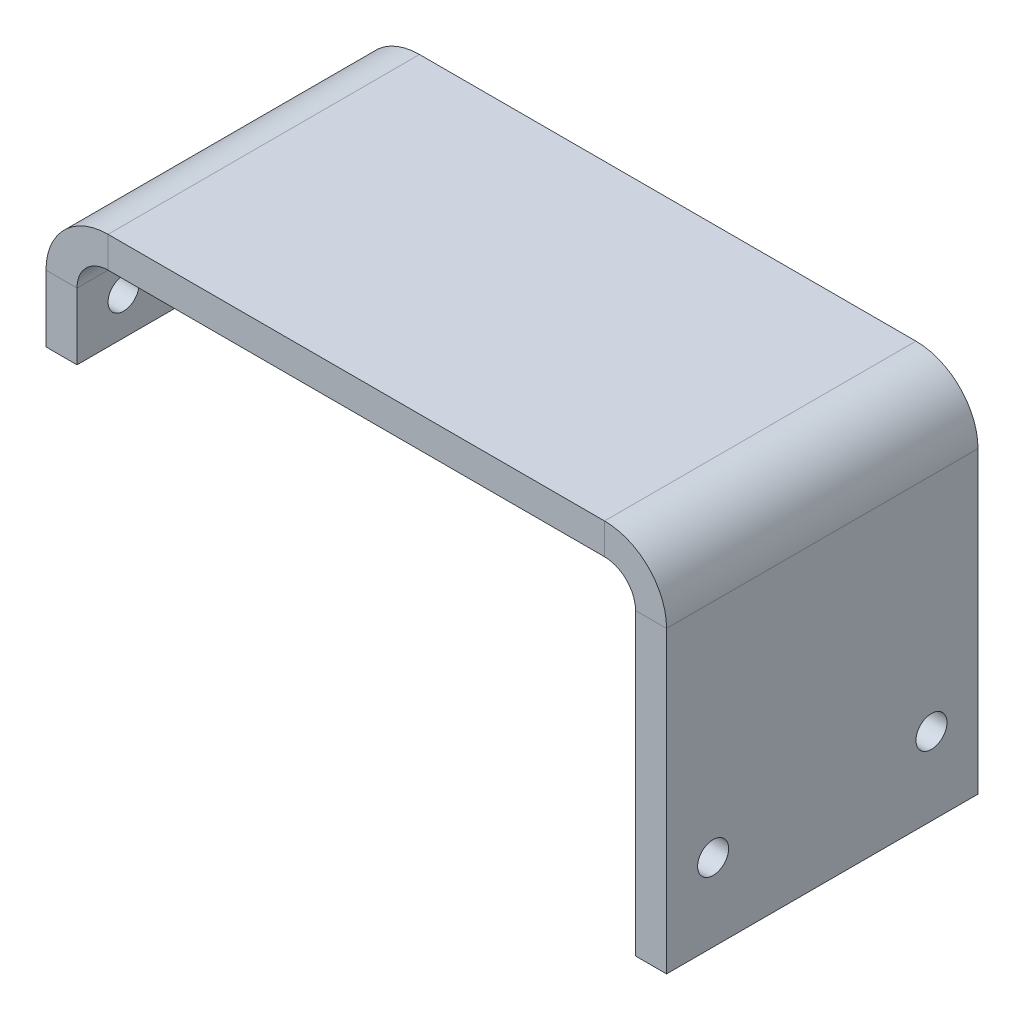
ISO-10303-21;
HEADER;
FILE_DESCRIPTION(('STEP AP214'),'2;1');
FILE_NAME('part.step','',(''),(''),'','','');
FILE_SCHEMA(('AUTOMOTIVE_DESIGN { 1 0 10303 214 1 1 1 1 }'));
ENDSEC;
DATA;
#1=APPLICATION_CONTEXT('core data for automotive mechanical design processes');
#2=APPLICATION_PROTOCOL_DEFINITION('international standard','automotive_design',2000,#1);
#3=PRODUCT_CONTEXT('',#1,'mechanical');
#4=PRODUCT('Part','Part','',(#3));
#5=PRODUCT_RELATED_PRODUCT_CATEGORY('part','',(#4));
#6=PRODUCT_DEFINITION_FORMATION('','',#4);
#7=PRODUCT_DEFINITION_CONTEXT('part definition',#1,'design');
#8=PRODUCT_DEFINITION('design','',#6,#7);
#9=PRODUCT_DEFINITION_SHAPE('','',#8);
#10=(LENGTH_UNIT() NAMED_UNIT(*) SI_UNIT(.MILLI.,.METRE.));
#11=(NAMED_UNIT(*) PLANE_ANGLE_UNIT() SI_UNIT($,.RADIAN.));
#12=(NAMED_UNIT(*) SI_UNIT($,.STERADIAN.) SOLID_ANGLE_UNIT());
#13=UNCERTAINTY_MEASURE_WITH_UNIT(LENGTH_MEASURE(1.E-05),#10,'distance_accuracy_value','');
#14=(GEOMETRIC_REPRESENTATION_CONTEXT(3) GLOBAL_UNCERTAINTY_ASSIGNED_CONTEXT((#13)) GLOBAL_UNIT_ASSIGNED_CONTEXT((#10,
#11,#12)) REPRESENTATION_CONTEXT('',''));
#15=CARTESIAN_POINT('',(0.,0.,0.));
#16=DIRECTION('',(0.,0.,1.));
#17=DIRECTION('',(1.,0.,0.));
#18=AXIS2_PLACEMENT_3D('',#15,#16,#17);
#19=CARTESIAN_POINT('',(-65.,-4.,20.075));
#20=DIRECTION('',(0.,0.,1.));
#21=DIRECTION('',(1.,0.,0.));
#22=AXIS2_PLACEMENT_3D('',#19,#20,#21);
#23=PLANE('',#22);
#24=DIRECTION('',(1.,0.,0.));
#25=VECTOR('',#24,1.);
#26=CARTESIAN_POINT('',(-65.,-4.,20.075));
#27=LINE('',#26,#25);
#28=CARTESIAN_POINT('',(-47.,-4.,20.075));
#29=VERTEX_POINT('',#28);
#30=CARTESIAN_POINT('',(17.,-4.,20.075));
#31=VERTEX_POINT('',#30);
#32=EDGE_CURVE('E221',#29,#31,#27,.T.);
#33=ORIENTED_EDGE('',*,*,#32,.T.);
#34=DIRECTION('',(0.,1.,0.));
#35=VECTOR('',#34,1.);
#36=CARTESIAN_POINT('',(17.,-4.,20.075));
#37=LINE('',#36,#35);
#38=CARTESIAN_POINT('',(17.,0.,20.075));
#39=VERTEX_POINT('',#38);
#40=EDGE_CURVE('E12',#31,#39,#37,.T.);
#41=ORIENTED_EDGE('',*,*,#40,.T.);
#42=DIRECTION('',(1.,0.,0.));
#43=VECTOR('',#42,1.);
#44=CARTESIAN_POINT('',(-65.,0.,20.075));
#45=LINE('',#44,#43);
#46=CARTESIAN_POINT('',(-47.,0.,20.075));
#47=VERTEX_POINT('',#46);
#48=EDGE_CURVE('E205',#47,#39,#45,.T.);
#49=ORIENTED_EDGE('',*,*,#48,.F.);
#50=DIRECTION('',(0.,1.,0.));
#51=VECTOR('',#50,1.);
#52=CARTESIAN_POINT('',(-47.,-4.,20.075));
#53=LINE('',#52,#51);
#54=EDGE_CURVE('E210',#29,#47,#53,.T.);
#55=ORIENTED_EDGE('',*,*,#54,.F.);
#56=EDGE_LOOP('',(#33,#41,#49,#55));
#57=FACE_BOUND('',#56,.T.);
#58=ADVANCED_FACE('F47',(#57),#23,.T.);
#59=CARTESIAN_POINT('',(-65.,-4.,-20.075));
#60=DIRECTION('',(0.,0.,-1.));
#61=DIRECTION('',(-1.,0.,0.));
#62=AXIS2_PLACEMENT_3D('',#59,#60,#61);
#63=PLANE('',#62);
#64=DIRECTION('',(-1.,0.,0.));
#65=VECTOR('',#64,1.);
#66=CARTESIAN_POINT('',(-65.,0.,-20.075));
#67=LINE('',#66,#65);
#68=CARTESIAN_POINT('',(17.,0.,-20.075));
#69=VERTEX_POINT('',#68);
#70=CARTESIAN_POINT('',(-47.,0.,-20.075));
#71=VERTEX_POINT('',#70);
#72=EDGE_CURVE('E206',#69,#71,#67,.T.);
#73=ORIENTED_EDGE('',*,*,#72,.F.);
#74=DIRECTION('',(0.,-1.,0.));
#75=VECTOR('',#74,1.);
#76=CARTESIAN_POINT('',(17.,-4.,-20.075));
#77=LINE('',#76,#75);
#78=CARTESIAN_POINT('',(17.,-4.,-20.075));
#79=VERTEX_POINT('',#78);
#80=EDGE_CURVE('E262',#69,#79,#77,.T.);
#81=ORIENTED_EDGE('',*,*,#80,.T.);
#82=DIRECTION('',(-1.,0.,0.));
#83=VECTOR('',#82,1.);
#84=CARTESIAN_POINT('',(-65.,-4.,-20.075));
#85=LINE('',#84,#83);
#86=CARTESIAN_POINT('',(-47.,-4.,-20.075));
#87=VERTEX_POINT('',#86);
#88=EDGE_CURVE('E50',#79,#87,#85,.T.);
#89=ORIENTED_EDGE('',*,*,#88,.T.);
#90=DIRECTION('',(0.,-1.,0.));
#91=VECTOR('',#90,1.);
#92=CARTESIAN_POINT('',(-47.,-4.,-20.075));
#93=LINE('',#92,#91);
#94=EDGE_CURVE('E207',#71,#87,#93,.T.);
#95=ORIENTED_EDGE('',*,*,#94,.F.);
#96=EDGE_LOOP('',(#73,#81,#89,#95));
#97=FACE_BOUND('',#96,.T.);
#98=ADVANCED_FACE('F275',(#97),#63,.T.);
#99=CARTESIAN_POINT('',(0.,-4.,0.));
#100=DIRECTION('',(0.,-1.,0.));
#101=DIRECTION('',(0.,0.,-1.));
#102=AXIS2_PLACEMENT_3D('',#99,#100,#101);
#103=PLANE('',#102);
#104=ORIENTED_EDGE('',*,*,#88,.F.);
#105=DIRECTION('',(0.,0.,1.));
#106=VECTOR('',#105,1.);
#107=CARTESIAN_POINT('',(17.,-4.,0.));
#108=LINE('',#107,#106);
#109=EDGE_CURVE('E253',#79,#31,#108,.T.);
#110=ORIENTED_EDGE('',*,*,#109,.T.);
#111=ORIENTED_EDGE('',*,*,#32,.F.);
#112=DIRECTION('',(0.,0.,1.));
#113=VECTOR('',#112,1.);
#114=CARTESIAN_POINT('',(-47.,-4.,0.));
#115=LINE('',#114,#113);
#116=EDGE_CURVE('E197',#87,#29,#115,.T.);
#117=ORIENTED_EDGE('',*,*,#116,.F.);
#118=EDGE_LOOP('',(#104,#110,#111,#117));
#119=FACE_BOUND('',#118,.T.);
#120=ADVANCED_FACE('F278',(#119),#103,.T.);
#121=CARTESIAN_POINT('',(-51.,-16.5752220392306,20.075));
#122=DIRECTION('',(0.,0.,1.));
#123=DIRECTION('',(0.,1.,0.));
#124=AXIS2_PLACEMENT_3D('',#121,#122,#123);
#125=PLANE('',#124);
#126=DIRECTION('',(0.,1.,0.));
#127=VECTOR('',#126,1.);
#128=CARTESIAN_POINT('',(-51.,-16.5752220392306,20.075));
#129=LINE('',#128,#127);
#130=CARTESIAN_POINT('',(-51.,-16.5752220392306,20.075));
#131=VERTEX_POINT('',#130);
#132=CARTESIAN_POINT('',(-51.,-8.,20.075));
#133=VERTEX_POINT('',#132);
#134=EDGE_CURVE('E231',#131,#133,#129,.T.);
#135=ORIENTED_EDGE('',*,*,#134,.T.);
#136=DIRECTION('',(-1.,0.,0.));
#137=VECTOR('',#136,1.);
#138=CARTESIAN_POINT('',(-51.,-8.,20.075));
#139=LINE('',#138,#137);
#140=CARTESIAN_POINT('',(-55.,-8.00000000000002,20.075));
#141=VERTEX_POINT('',#140);
#142=EDGE_CURVE('E250',#133,#141,#139,.T.);
#143=ORIENTED_EDGE('',*,*,#142,.T.);
#144=DIRECTION('',(0.,1.,0.));
#145=VECTOR('',#144,1.);
#146=CARTESIAN_POINT('',(-55.,-16.5752220392306,20.075));
#147=LINE('',#146,#145);
#148=CARTESIAN_POINT('',(-55.,-16.5752220392306,20.075));
#149=VERTEX_POINT('',#148);
#150=EDGE_CURVE('E236',#149,#141,#147,.T.);
#151=ORIENTED_EDGE('',*,*,#150,.F.);
#152=DIRECTION('',(-1.,0.,0.));
#153=VECTOR('',#152,1.);
#154=CARTESIAN_POINT('',(-51.,-16.5752220392306,20.075));
#155=LINE('',#154,#153);
#156=EDGE_CURVE('E237',#131,#149,#155,.T.);
#157=ORIENTED_EDGE('',*,*,#156,.F.);
#158=EDGE_LOOP('',(#135,#143,#151,#157));
#159=FACE_BOUND('',#158,.T.);
#160=ADVANCED_FACE('F291',(#159),#125,.T.);
#161=CARTESIAN_POINT('',(-51.,-16.5752220392306,-20.075));
#162=DIRECTION('',(0.,0.,-1.));
#163=DIRECTION('',(0.,-1.,0.));
#164=AXIS2_PLACEMENT_3D('',#161,#162,#163);
#165=PLANE('',#164);
#166=DIRECTION('',(0.,-1.,0.));
#167=VECTOR('',#166,1.);
#168=CARTESIAN_POINT('',(-55.,-16.5752220392306,-20.075));
#169=LINE('',#168,#167);
#170=CARTESIAN_POINT('',(-55.,-8.00000000000002,-20.075));
#171=VERTEX_POINT('',#170);
#172=CARTESIAN_POINT('',(-55.,-16.5752220392306,-20.075));
#173=VERTEX_POINT('',#172);
#174=EDGE_CURVE('E225',#171,#173,#169,.T.);
#175=ORIENTED_EDGE('',*,*,#174,.F.);
#176=DIRECTION('',(1.,0.,0.));
#177=VECTOR('',#176,1.);
#178=CARTESIAN_POINT('',(-51.,-8.00000000000001,-20.075));
#179=LINE('',#178,#177);
#180=CARTESIAN_POINT('',(-51.,-8.00000000000002,-20.075));
#181=VERTEX_POINT('',#180);
#182=EDGE_CURVE('E245',#171,#181,#179,.T.);
#183=ORIENTED_EDGE('',*,*,#182,.T.);
#184=DIRECTION('',(0.,-1.,0.));
#185=VECTOR('',#184,1.);
#186=CARTESIAN_POINT('',(-51.,-16.5752220392306,-20.075));
#187=LINE('',#186,#185);
#188=CARTESIAN_POINT('',(-51.,-16.5752220392306,-20.075));
#189=VERTEX_POINT('',#188);
#190=EDGE_CURVE('E232',#181,#189,#187,.T.);
#191=ORIENTED_EDGE('',*,*,#190,.T.);
#192=DIRECTION('',(-1.,0.,0.));
#193=VECTOR('',#192,1.);
#194=CARTESIAN_POINT('',(-51.,-16.5752220392306,-20.075));
#195=LINE('',#194,#193);
#196=EDGE_CURVE('E240',#189,#173,#195,.T.);
#197=ORIENTED_EDGE('',*,*,#196,.T.);
#198=EDGE_LOOP('',(#175,#183,#191,#197));
#199=FACE_BOUND('',#198,.T.);
#200=ADVANCED_FACE('F299',(#199),#165,.T.);
#201=CARTESIAN_POINT('',(-51.0000000000002,48.4247779607694,0.));
#202=DIRECTION('',(1.,0.,0.));
#203=DIRECTION('',(0.,0.,-1.));
#204=AXIS2_PLACEMENT_3D('',#201,#202,#203);
#205=PLANE('',#204);
#206=CARTESIAN_POINT('',(-51.,-11.5752220392306,-14.075));
#207=DIRECTION('',(-1.,0.,0.));
#208=DIRECTION('',(0.,0.,1.));
#209=AXIS2_PLACEMENT_3D('',#206,#207,#208);
#210=CIRCLE('',#209,2.);
#211=CARTESIAN_POINT('',(-51.,-11.5752220392306,-12.075));
#212=VERTEX_POINT('',#211);
#213=EDGE_CURVE('E222',#212,#212,#210,.T.);
#214=ORIENTED_EDGE('',*,*,#213,.T.);
#215=EDGE_LOOP('',(#214));
#216=FACE_BOUND('',#215,.T.);
#217=CARTESIAN_POINT('',(-51.,-11.5752220392306,14.075));
#218=DIRECTION('',(-1.,0.,0.));
#219=DIRECTION('',(0.,0.,-1.));
#220=AXIS2_PLACEMENT_3D('',#217,#218,#219);
#221=CIRCLE('',#220,2.);
#222=CARTESIAN_POINT('',(-51.,-11.5752220392306,12.075));
#223=VERTEX_POINT('',#222);
#224=EDGE_CURVE('E214',#223,#223,#221,.T.);
#225=ORIENTED_EDGE('',*,*,#224,.T.);
#226=EDGE_LOOP('',(#225));
#227=FACE_BOUND('',#226,.T.);
#228=ORIENTED_EDGE('',*,*,#190,.F.);
#229=DIRECTION('',(0.,0.,1.));
#230=VECTOR('',#229,1.);
#231=CARTESIAN_POINT('',(-51.,-8.00000000000001,0.));
#232=LINE('',#231,#230);
#233=EDGE_CURVE('E239',#181,#133,#232,.T.);
#234=ORIENTED_EDGE('',*,*,#233,.T.);
#235=ORIENTED_EDGE('',*,*,#134,.F.);
#236=DIRECTION('',(0.,0.,1.));
#237=VECTOR('',#236,1.);
#238=CARTESIAN_POINT('',(-51.,-16.5752220392306,20.075));
#239=LINE('',#238,#237);
#240=EDGE_CURVE('E228',#189,#131,#239,.T.);
#241=ORIENTED_EDGE('',*,*,#240,.F.);
#242=EDGE_LOOP('',(#228,#234,#235,#241));
#243=FACE_BOUND('',#242,.T.);
#244=ADVANCED_FACE('F288',(#216,#227,#243),#205,.T.);
#245=CARTESIAN_POINT('',(-51.,-16.5752220392306,20.075));
#246=DIRECTION('',(0.,-1.,0.));
#247=DIRECTION('',(0.,0.,1.));
#248=AXIS2_PLACEMENT_3D('',#245,#246,#247);
#249=PLANE('',#248);
#250=DIRECTION('',(0.,0.,1.));
#251=VECTOR('',#250,1.);
#252=CARTESIAN_POINT('',(-55.,-16.5752220392306,20.075));
#253=LINE('',#252,#251);
#254=EDGE_CURVE('E233',#173,#149,#253,.T.);
#255=ORIENTED_EDGE('',*,*,#254,.F.);
#256=ORIENTED_EDGE('',*,*,#196,.F.);
#257=ORIENTED_EDGE('',*,*,#240,.T.);
#258=ORIENTED_EDGE('',*,*,#156,.T.);
#259=EDGE_LOOP('',(#255,#256,#257,#258));
#260=FACE_BOUND('',#259,.T.);
#261=ADVANCED_FACE('F296',(#260),#249,.T.);
#262=CARTESIAN_POINT('',(-55.0000000000002,48.4247779607694,0.));
#263=DIRECTION('',(1.,0.,0.));
#264=DIRECTION('',(0.,0.,-1.));
#265=AXIS2_PLACEMENT_3D('',#262,#263,#264);
#266=PLANE('',#265);
#267=DIRECTION('',(0.,0.,1.));
#268=VECTOR('',#267,1.);
#269=CARTESIAN_POINT('',(-55.,-8.00000000000002,0.));
#270=LINE('',#269,#268);
#271=EDGE_CURVE('E248',#171,#141,#270,.T.);
#272=ORIENTED_EDGE('',*,*,#271,.F.);
#273=ORIENTED_EDGE('',*,*,#174,.T.);
#274=ORIENTED_EDGE('',*,*,#254,.T.);
#275=ORIENTED_EDGE('',*,*,#150,.T.);
#276=EDGE_LOOP('',(#272,#273,#274,#275));
#277=FACE_BOUND('',#276,.T.);
#278=CARTESIAN_POINT('',(-55.,-11.5752220392306,14.075));
#279=DIRECTION('',(-1.,0.,0.));
#280=DIRECTION('',(0.,0.,-1.));
#281=AXIS2_PLACEMENT_3D('',#278,#279,#280);
#282=CIRCLE('',#281,2.);
#283=CARTESIAN_POINT('',(-55.,-11.5752220392306,12.075));
#284=VERTEX_POINT('',#283);
#285=EDGE_CURVE('E218',#284,#284,#282,.T.);
#286=ORIENTED_EDGE('',*,*,#285,.F.);
#287=EDGE_LOOP('',(#286));
#288=FACE_BOUND('',#287,.T.);
#289=CARTESIAN_POINT('',(-55.,-11.5752220392306,-14.075));
#290=DIRECTION('',(-1.,0.,0.));
#291=DIRECTION('',(0.,0.,1.));
#292=AXIS2_PLACEMENT_3D('',#289,#290,#291);
#293=CIRCLE('',#292,2.);
#294=CARTESIAN_POINT('',(-55.,-11.5752220392306,-12.075));
#295=VERTEX_POINT('',#294);
#296=EDGE_CURVE('E217',#295,#295,#293,.T.);
#297=ORIENTED_EDGE('',*,*,#296,.F.);
#298=EDGE_LOOP('',(#297));
#299=FACE_BOUND('',#298,.T.);
#300=ADVANCED_FACE('F380',(#277,#288,#299),#266,.F.);
#301=CARTESIAN_POINT('',(-51.,-11.5752220392306,-14.075));
#302=DIRECTION('',(-1.,0.,0.));
#303=DIRECTION('',(0.,0.,1.));
#304=AXIS2_PLACEMENT_3D('',#301,#302,#303);
#305=CYLINDRICAL_SURFACE('',#304,2.);
#306=ORIENTED_EDGE('',*,*,#213,.F.);
#307=EDGE_LOOP('',(#306));
#308=FACE_BOUND('',#307,.T.);
#309=ORIENTED_EDGE('',*,*,#296,.T.);
#310=EDGE_LOOP('',(#309));
#311=FACE_BOUND('',#310,.T.);
#312=ADVANCED_FACE('F374',(#308,#311),#305,.F.);
#313=CARTESIAN_POINT('',(-51.,-11.5752220392306,14.075));
#314=DIRECTION('',(-1.,0.,0.));
#315=DIRECTION('',(0.,0.,1.));
#316=AXIS2_PLACEMENT_3D('',#313,#314,#315);
#317=CYLINDRICAL_SURFACE('',#316,2.);
#318=ORIENTED_EDGE('',*,*,#224,.F.);
#319=EDGE_LOOP('',(#318));
#320=FACE_BOUND('',#319,.T.);
#321=ORIENTED_EDGE('',*,*,#285,.T.);
#322=EDGE_LOOP('',(#321));
#323=FACE_BOUND('',#322,.T.);
#324=ADVANCED_FACE('F368',(#320,#323),#317,.F.);
#325=CARTESIAN_POINT('',(0.,0.,0.));
#326=DIRECTION('',(0.,-1.,0.));
#327=DIRECTION('',(0.,0.,-1.));
#328=AXIS2_PLACEMENT_3D('',#325,#326,#327);
#329=PLANE('',#328);
#330=DIRECTION('',(0.,0.,1.));
#331=VECTOR('',#330,1.);
#332=CARTESIAN_POINT('',(17.,0.,0.));
#333=LINE('',#332,#331);
#334=EDGE_CURVE('E55',#69,#39,#333,.T.);
#335=ORIENTED_EDGE('',*,*,#334,.F.);
#336=ORIENTED_EDGE('',*,*,#72,.T.);
#337=DIRECTION('',(0.,0.,1.));
#338=VECTOR('',#337,1.);
#339=CARTESIAN_POINT('',(-47.,0.,0.));
#340=LINE('',#339,#338);
#341=EDGE_CURVE('E202',#71,#47,#340,.T.);
#342=ORIENTED_EDGE('',*,*,#341,.T.);
#343=ORIENTED_EDGE('',*,*,#48,.T.);
#344=EDGE_LOOP('',(#335,#336,#342,#343));
#345=FACE_BOUND('',#344,.T.);
#346=ADVANCED_FACE('F304',(#345),#329,.F.);
#347=CARTESIAN_POINT('',(-47.,-8.,-20.075));
#348=DIRECTION('',(0.,0.,1.));
#349=DIRECTION('',(1.,0.,0.));
#350=AXIS2_PLACEMENT_3D('',#347,#348,#349);
#351=PLANE('',#350);
#352=ORIENTED_EDGE('',*,*,#182,.F.);
#353=CARTESIAN_POINT('',(-47.,-8.,-20.075));
#354=DIRECTION('',(0.,0.,-1.));
#355=DIRECTION('',(-1.,0.,0.));
#356=AXIS2_PLACEMENT_3D('',#353,#354,#355);
#357=CIRCLE('',#356,8.);
#358=EDGE_CURVE('E188',#171,#71,#357,.T.);
#359=ORIENTED_EDGE('',*,*,#358,.T.);
#360=ORIENTED_EDGE('',*,*,#94,.T.);
#361=CARTESIAN_POINT('',(-47.,-8.,-20.075));
#362=DIRECTION('',(0.,0.,-1.));
#363=DIRECTION('',(1.,0.,0.));
#364=AXIS2_PLACEMENT_3D('',#361,#362,#363);
#365=CIRCLE('',#364,4.);
#366=EDGE_CURVE('E192',#181,#87,#365,.T.);
#367=ORIENTED_EDGE('',*,*,#366,.F.);
#368=EDGE_LOOP('',(#352,#359,#360,#367));
#369=FACE_BOUND('',#368,.T.);
#370=ADVANCED_FACE('F282',(#369),#351,.F.);
#371=CARTESIAN_POINT('',(-47.,-8.,20.075));
#372=DIRECTION('',(0.,0.,-1.));
#373=DIRECTION('',(-1.,0.,0.));
#374=AXIS2_PLACEMENT_3D('',#371,#372,#373);
#375=PLANE('',#374);
#376=CARTESIAN_POINT('',(-47.,-8.,20.075));
#377=DIRECTION('',(0.,0.,-1.));
#378=DIRECTION('',(-1.,0.,0.));
#379=AXIS2_PLACEMENT_3D('',#376,#377,#378);
#380=CIRCLE('',#379,8.);
#381=EDGE_CURVE('E195',#47,#141,#380,.F.);
#382=ORIENTED_EDGE('',*,*,#381,.T.);
#383=ORIENTED_EDGE('',*,*,#142,.F.);
#384=CARTESIAN_POINT('',(-47.,-8.,20.075));
#385=DIRECTION('',(0.,0.,1.));
#386=DIRECTION('',(-1.,0.,0.));
#387=AXIS2_PLACEMENT_3D('',#384,#385,#386);
#388=CIRCLE('',#387,4.);
#389=EDGE_CURVE('E70',#29,#133,#388,.T.);
#390=ORIENTED_EDGE('',*,*,#389,.F.);
#391=ORIENTED_EDGE('',*,*,#54,.T.);
#392=EDGE_LOOP('',(#382,#383,#390,#391));
#393=FACE_BOUND('',#392,.T.);
#394=ADVANCED_FACE('F306',(#393),#375,.F.);
#395=CARTESIAN_POINT('',(-47.,-8.,41.4348758850537));
#396=DIRECTION('',(0.,0.,-1.));
#397=DIRECTION('',(-1.,0.,0.));
#398=AXIS2_PLACEMENT_3D('',#395,#396,#397);
#399=CYLINDRICAL_SURFACE('',#398,4.);
#400=ORIENTED_EDGE('',*,*,#116,.T.);
#401=ORIENTED_EDGE('',*,*,#389,.T.);
#402=ORIENTED_EDGE('',*,*,#233,.F.);
#403=ORIENTED_EDGE('',*,*,#366,.T.);
#404=EDGE_LOOP('',(#400,#401,#402,#403));
#405=FACE_BOUND('',#404,.T.);
#406=ADVANCED_FACE('F285',(#405),#399,.F.);
#407=CARTESIAN_POINT('',(-47.,-8.,41.4348758850537));
#408=DIRECTION('',(0.,0.,-1.));
#409=DIRECTION('',(-1.,0.,0.));
#410=AXIS2_PLACEMENT_3D('',#407,#408,#409);
#411=CYLINDRICAL_SURFACE('',#410,8.);
#412=ORIENTED_EDGE('',*,*,#341,.F.);
#413=ORIENTED_EDGE('',*,*,#358,.F.);
#414=ORIENTED_EDGE('',*,*,#271,.T.);
#415=ORIENTED_EDGE('',*,*,#381,.F.);
#416=EDGE_LOOP('',(#412,#413,#414,#415));
#417=FACE_BOUND('',#416,.T.);
#418=ADVANCED_FACE('F302',(#417),#411,.T.);
#419=CARTESIAN_POINT('',(17.,-8.,-20.075));
#420=DIRECTION('',(0.,0.,1.));
#421=DIRECTION('',(1.,0.,0.));
#422=AXIS2_PLACEMENT_3D('',#419,#420,#421);
#423=PLANE('',#422);
#424=ORIENTED_EDGE('',*,*,#80,.F.);
#425=CARTESIAN_POINT('',(17.,-8.,-20.075));
#426=DIRECTION('',(0.,0.,1.));
#427=DIRECTION('',(1.,0.,0.));
#428=AXIS2_PLACEMENT_3D('',#425,#426,#427);
#429=CIRCLE('',#428,8.);
#430=CARTESIAN_POINT('',(25.,-8.00000000000003,-20.075));
#431=VERTEX_POINT('',#430);
#432=EDGE_CURVE('E156',#69,#431,#429,.F.);
#433=ORIENTED_EDGE('',*,*,#432,.T.);
#434=DIRECTION('',(-1.,0.,0.));
#435=VECTOR('',#434,1.);
#436=CARTESIAN_POINT('',(21.,-8.00000000000001,-20.075));
#437=LINE('',#436,#435);
#438=CARTESIAN_POINT('',(21.,-8.00000000000001,-20.075));
#439=VERTEX_POINT('',#438);
#440=EDGE_CURVE('E175',#431,#439,#437,.T.);
#441=ORIENTED_EDGE('',*,*,#440,.T.);
#442=CARTESIAN_POINT('',(17.,-8.,-20.075));
#443=DIRECTION('',(0.,0.,-1.));
#444=DIRECTION('',(1.,0.,0.));
#445=AXIS2_PLACEMENT_3D('',#442,#443,#444);
#446=CIRCLE('',#445,4.);
#447=EDGE_CURVE('E181',#79,#439,#446,.T.);
#448=ORIENTED_EDGE('',*,*,#447,.F.);
#449=EDGE_LOOP('',(#424,#433,#441,#448));
#450=FACE_BOUND('',#449,.T.);
#451=ADVANCED_FACE('F323',(#450),#423,.F.);
#452=CARTESIAN_POINT('',(17.,-8.,20.075));
#453=DIRECTION('',(0.,0.,-1.));
#454=DIRECTION('',(-1.,0.,0.));
#455=AXIS2_PLACEMENT_3D('',#452,#453,#454);
#456=PLANE('',#455);
#457=DIRECTION('',(1.,0.,0.));
#458=VECTOR('',#457,1.);
#459=CARTESIAN_POINT('',(21.,-8.00000000000001,20.075));
#460=LINE('',#459,#458);
#461=CARTESIAN_POINT('',(21.,-8.00000000000002,20.075));
#462=VERTEX_POINT('',#461);
#463=CARTESIAN_POINT('',(25.,-8.00000000000003,20.075));
#464=VERTEX_POINT('',#463);
#465=EDGE_CURVE('E145',#462,#464,#460,.T.);
#466=ORIENTED_EDGE('',*,*,#465,.T.);
#467=CARTESIAN_POINT('',(17.,-8.,20.075));
#468=DIRECTION('',(0.,0.,1.));
#469=DIRECTION('',(1.,0.,0.));
#470=AXIS2_PLACEMENT_3D('',#467,#468,#469);
#471=CIRCLE('',#470,8.);
#472=EDGE_CURVE('E185',#464,#39,#471,.T.);
#473=ORIENTED_EDGE('',*,*,#472,.T.);
#474=ORIENTED_EDGE('',*,*,#40,.F.);
#475=CARTESIAN_POINT('',(17.,-8.,20.075));
#476=DIRECTION('',(0.,0.,1.));
#477=DIRECTION('',(-1.,0.,0.));
#478=AXIS2_PLACEMENT_3D('',#475,#476,#477);
#479=CIRCLE('',#478,4.);
#480=EDGE_CURVE('E184',#462,#31,#479,.T.);
#481=ORIENTED_EDGE('',*,*,#480,.F.);
#482=EDGE_LOOP('',(#466,#473,#474,#481));
#483=FACE_BOUND('',#482,.T.);
#484=ADVANCED_FACE('F310',(#483),#456,.F.);
#485=CARTESIAN_POINT('',(17.,-8.,-41.4348758850537));
#486=DIRECTION('',(0.,0.,1.));
#487=DIRECTION('',(1.,0.,0.));
#488=AXIS2_PLACEMENT_3D('',#485,#486,#487);
#489=CYLINDRICAL_SURFACE('',#488,4.);
#490=ORIENTED_EDGE('',*,*,#480,.T.);
#491=ORIENTED_EDGE('',*,*,#109,.F.);
#492=ORIENTED_EDGE('',*,*,#447,.T.);
#493=DIRECTION('',(0.,0.,1.));
#494=VECTOR('',#493,1.);
#495=CARTESIAN_POINT('',(21.,-8.00000000000002,0.));
#496=LINE('',#495,#494);
#497=EDGE_CURVE('E179',#439,#462,#496,.T.);
#498=ORIENTED_EDGE('',*,*,#497,.T.);
#499=EDGE_LOOP('',(#490,#491,#492,#498));
#500=FACE_BOUND('',#499,.T.);
#501=ADVANCED_FACE('F313',(#500),#489,.F.);
#502=CARTESIAN_POINT('',(17.,-8.,-41.4348758850537));
#503=DIRECTION('',(0.,0.,1.));
#504=DIRECTION('',(1.,0.,0.));
#505=AXIS2_PLACEMENT_3D('',#502,#503,#504);
#506=CYLINDRICAL_SURFACE('',#505,8.);
#507=ORIENTED_EDGE('',*,*,#472,.F.);
#508=DIRECTION('',(0.,0.,1.));
#509=VECTOR('',#508,1.);
#510=CARTESIAN_POINT('',(25.,-8.00000000000003,0.));
#511=LINE('',#510,#509);
#512=EDGE_CURVE('E326',#431,#464,#511,.T.);
#513=ORIENTED_EDGE('',*,*,#512,.F.);
#514=ORIENTED_EDGE('',*,*,#432,.F.);
#515=ORIENTED_EDGE('',*,*,#334,.T.);
#516=EDGE_LOOP('',(#507,#513,#514,#515));
#517=FACE_BOUND('',#516,.T.);
#518=ADVANCED_FACE('F324',(#517),#506,.T.);
#519=CARTESIAN_POINT('',(20.9999999999999,-36.5752220392306,-14.075));
#520=DIRECTION('',(1.,0.,0.));
#521=DIRECTION('',(0.,0.,1.));
#522=AXIS2_PLACEMENT_3D('',#519,#520,#521);
#523=CYLINDRICAL_SURFACE('',#522,2.);
#524=CARTESIAN_POINT('',(20.9999999999999,-36.5752220392306,-14.075));
#525=DIRECTION('',(1.,0.,0.));
#526=DIRECTION('',(0.,0.,1.));
#527=AXIS2_PLACEMENT_3D('',#524,#525,#526);
#528=CIRCLE('',#527,2.);
#529=CARTESIAN_POINT('',(20.9999999999999,-36.5752220392306,-12.075));
#530=VERTEX_POINT('',#529);
#531=EDGE_CURVE('E320',#530,#530,#528,.T.);
#532=ORIENTED_EDGE('',*,*,#531,.F.);
#533=EDGE_LOOP('',(#532));
#534=FACE_BOUND('',#533,.T.);
#535=CARTESIAN_POINT('',(24.9999999999999,-36.5752220392306,-14.075));
#536=DIRECTION('',(1.,0.,0.));
#537=DIRECTION('',(0.,0.,1.));
#538=AXIS2_PLACEMENT_3D('',#535,#536,#537);
#539=CIRCLE('',#538,2.);
#540=CARTESIAN_POINT('',(24.9999999999999,-36.5752220392306,-12.075));
#541=VERTEX_POINT('',#540);
#542=EDGE_CURVE('E169',#541,#541,#539,.T.);
#543=ORIENTED_EDGE('',*,*,#542,.T.);
#544=EDGE_LOOP('',(#543));
#545=FACE_BOUND('',#544,.T.);
#546=ADVANCED_FACE('F342',(#534,#545),#523,.F.);
#547=CARTESIAN_POINT('',(20.9999999999999,-36.5752220392306,14.075));
#548=DIRECTION('',(1.,0.,0.));
#549=DIRECTION('',(0.,0.,1.));
#550=AXIS2_PLACEMENT_3D('',#547,#548,#549);
#551=CYLINDRICAL_SURFACE('',#550,2.);
#552=CARTESIAN_POINT('',(20.9999999999999,-36.5752220392306,14.075));
#553=DIRECTION('',(1.,0.,0.));
#554=DIRECTION('',(0.,0.,-1.));
#555=AXIS2_PLACEMENT_3D('',#552,#553,#554);
#556=CIRCLE('',#555,2.);
#557=CARTESIAN_POINT('',(20.9999999999999,-36.5752220392306,12.075));
#558=VERTEX_POINT('',#557);
#559=EDGE_CURVE('E166',#558,#558,#556,.T.);
#560=ORIENTED_EDGE('',*,*,#559,.F.);
#561=EDGE_LOOP('',(#560));
#562=FACE_BOUND('',#561,.T.);
#563=CARTESIAN_POINT('',(24.9999999999999,-36.5752220392306,14.075));
#564=DIRECTION('',(1.,0.,0.));
#565=DIRECTION('',(0.,0.,-1.));
#566=AXIS2_PLACEMENT_3D('',#563,#564,#565);
#567=CIRCLE('',#566,2.);
#568=CARTESIAN_POINT('',(24.9999999999999,-36.5752220392306,12.075));
#569=VERTEX_POINT('',#568);
#570=EDGE_CURVE('E164',#569,#569,#567,.T.);
#571=ORIENTED_EDGE('',*,*,#570,.T.);
#572=EDGE_LOOP('',(#571));
#573=FACE_BOUND('',#572,.T.);
#574=ADVANCED_FACE('F339',(#562,#573),#551,.F.);
#575=CARTESIAN_POINT('',(20.9999999999999,-46.5752220392306,20.075));
#576=DIRECTION('',(0.,-1.,0.));
#577=DIRECTION('',(0.,0.,-1.));
#578=AXIS2_PLACEMENT_3D('',#575,#576,#577);
#579=PLANE('',#578);
#580=DIRECTION('',(0.,0.,-1.));
#581=VECTOR('',#580,1.);
#582=CARTESIAN_POINT('',(24.9999999999999,-46.5752220392306,20.075));
#583=LINE('',#582,#581);
#584=CARTESIAN_POINT('',(24.9999999999999,-46.5752220392306,20.075));
#585=VERTEX_POINT('',#584);
#586=CARTESIAN_POINT('',(24.9999999999999,-46.5752220392306,-20.075));
#587=VERTEX_POINT('',#586);
#588=EDGE_CURVE('E149',#585,#587,#583,.T.);
#589=ORIENTED_EDGE('',*,*,#588,.F.);
#590=DIRECTION('',(1.,0.,0.));
#591=VECTOR('',#590,1.);
#592=CARTESIAN_POINT('',(20.9999999999999,-46.5752220392306,20.075));
#593=LINE('',#592,#591);
#594=CARTESIAN_POINT('',(20.9999999999999,-46.5752220392306,20.075));
#595=VERTEX_POINT('',#594);
#596=EDGE_CURVE('E142',#595,#585,#593,.T.);
#597=ORIENTED_EDGE('',*,*,#596,.F.);
#598=DIRECTION('',(0.,0.,-1.));
#599=VECTOR('',#598,1.);
#600=CARTESIAN_POINT('',(20.9999999999999,-46.5752220392306,20.075));
#601=LINE('',#600,#599);
#602=CARTESIAN_POINT('',(20.9999999999999,-46.5752220392306,-20.075));
#603=VERTEX_POINT('',#602);
#604=EDGE_CURVE('E154',#595,#603,#601,.T.);
#605=ORIENTED_EDGE('',*,*,#604,.T.);
#606=DIRECTION('',(1.,0.,0.));
#607=VECTOR('',#606,1.);
#608=CARTESIAN_POINT('',(20.9999999999999,-46.5752220392306,-20.075));
#609=LINE('',#608,#607);
#610=EDGE_CURVE('E163',#603,#587,#609,.T.);
#611=ORIENTED_EDGE('',*,*,#610,.T.);
#612=EDGE_LOOP('',(#589,#597,#605,#611));
#613=FACE_BOUND('',#612,.T.);
#614=ADVANCED_FACE('F153',(#613),#579,.T.);
#615=CARTESIAN_POINT('',(21.0000000000001,18.4247779607694,0.));
#616=DIRECTION('',(-1.,0.,0.));
#617=DIRECTION('',(0.,0.,-1.));
#618=AXIS2_PLACEMENT_3D('',#615,#616,#617);
#619=PLANE('',#618);
#620=ORIENTED_EDGE('',*,*,#497,.F.);
#621=DIRECTION('',(0.,1.,0.));
#622=VECTOR('',#621,1.);
#623=CARTESIAN_POINT('',(21.0000000000003,83.4247779607694,-20.075));
#624=LINE('',#623,#622);
#625=EDGE_CURVE('E162',#603,#439,#624,.T.);
#626=ORIENTED_EDGE('',*,*,#625,.F.);
#627=ORIENTED_EDGE('',*,*,#604,.F.);
#628=DIRECTION('',(0.,-1.,0.));
#629=VECTOR('',#628,1.);
#630=CARTESIAN_POINT('',(21.0000000000004,83.4247779607694,20.075));
#631=LINE('',#630,#629);
#632=EDGE_CURVE('E139',#462,#595,#631,.T.);
#633=ORIENTED_EDGE('',*,*,#632,.F.);
#634=EDGE_LOOP('',(#620,#626,#627,#633));
#635=FACE_BOUND('',#634,.T.);
#636=ORIENTED_EDGE('',*,*,#559,.T.);
#637=EDGE_LOOP('',(#636));
#638=FACE_BOUND('',#637,.T.);
#639=ORIENTED_EDGE('',*,*,#531,.T.);
#640=EDGE_LOOP('',(#639));
#641=FACE_BOUND('',#640,.T.);
#642=ADVANCED_FACE('F159',(#635,#638,#641),#619,.T.);
#643=CARTESIAN_POINT('',(21.0000000000003,83.4247779607694,-20.075));
#644=DIRECTION('',(0.,0.,-1.));
#645=DIRECTION('',(0.,1.,0.));
#646=AXIS2_PLACEMENT_3D('',#643,#644,#645);
#647=PLANE('',#646);
#648=ORIENTED_EDGE('',*,*,#440,.F.);
#649=DIRECTION('',(0.,1.,0.));
#650=VECTOR('',#649,1.);
#651=CARTESIAN_POINT('',(25.0000000000003,83.4247779607694,-20.075));
#652=LINE('',#651,#650);
#653=EDGE_CURVE('E319',#587,#431,#652,.T.);
#654=ORIENTED_EDGE('',*,*,#653,.F.);
#655=ORIENTED_EDGE('',*,*,#610,.F.);
#656=ORIENTED_EDGE('',*,*,#625,.T.);
#657=EDGE_LOOP('',(#648,#654,#655,#656));
#658=FACE_BOUND('',#657,.T.);
#659=ADVANCED_FACE('F316',(#658),#647,.T.);
#660=CARTESIAN_POINT('',(25.0000000000001,18.4247779607694,0.));
#661=DIRECTION('',(-1.,0.,0.));
#662=DIRECTION('',(0.,0.,-1.));
#663=AXIS2_PLACEMENT_3D('',#660,#661,#662);
#664=PLANE('',#663);
#665=ORIENTED_EDGE('',*,*,#542,.F.);
#666=EDGE_LOOP('',(#665));
#667=FACE_BOUND('',#666,.T.);
#668=ORIENTED_EDGE('',*,*,#570,.F.);
#669=EDGE_LOOP('',(#668));
#670=FACE_BOUND('',#669,.T.);
#671=ORIENTED_EDGE('',*,*,#653,.T.);
#672=ORIENTED_EDGE('',*,*,#512,.T.);
#673=DIRECTION('',(0.,-1.,0.));
#674=VECTOR('',#673,1.);
#675=CARTESIAN_POINT('',(25.0000000000004,83.4247779607694,20.075));
#676=LINE('',#675,#674);
#677=EDGE_CURVE('E328',#464,#585,#676,.T.);
#678=ORIENTED_EDGE('',*,*,#677,.T.);
#679=ORIENTED_EDGE('',*,*,#588,.T.);
#680=EDGE_LOOP('',(#671,#672,#678,#679));
#681=FACE_BOUND('',#680,.T.);
#682=ADVANCED_FACE('F346',(#667,#670,#681),#664,.F.);
#683=CARTESIAN_POINT('',(21.0000000000004,83.4247779607694,20.075));
#684=DIRECTION('',(0.,0.,1.));
#685=DIRECTION('',(0.,-1.,0.));
#686=AXIS2_PLACEMENT_3D('',#683,#684,#685);
#687=PLANE('',#686);
#688=ORIENTED_EDGE('',*,*,#465,.F.);
#689=ORIENTED_EDGE('',*,*,#632,.T.);
#690=ORIENTED_EDGE('',*,*,#596,.T.);
#691=ORIENTED_EDGE('',*,*,#677,.F.);
#692=EDGE_LOOP('',(#688,#689,#690,#691));
#693=FACE_BOUND('',#692,.T.);
#694=ADVANCED_FACE('F141',(#693),#687,.T.);
#695=CLOSED_SHELL('',(#58,#98,#120,#160,#200,#244,#261,#300,#312,#324,#346,#370,#394,#406,#418,
#451,#484,#501,#518,#546,#574,#614,#642,#659,#682,#694));
#696=MANIFOLD_SOLID_BREP('B2',#695);
#697=ADVANCED_BREP_SHAPE_REPRESENTATION('',(#18,#696),#14);
#698=SHAPE_DEFINITION_REPRESENTATION(#9,#697);
ENDSEC;
END-ISO-10303-21;
